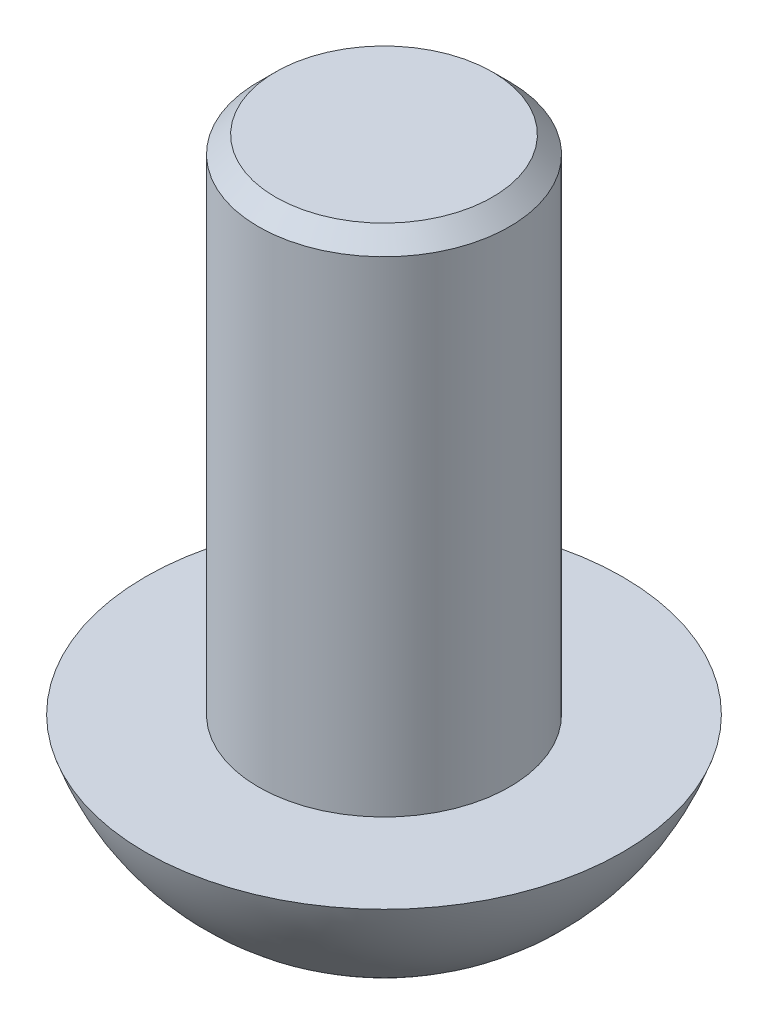
ISO-10303-21;
HEADER;
FILE_DESCRIPTION(('STEP AP214'),'2;1');
FILE_NAME('part.step','',(''),(''),'','','');
FILE_SCHEMA(('AUTOMOTIVE_DESIGN { 1 0 10303 214 1 1 1 1 }'));
ENDSEC;
DATA;
#1=APPLICATION_CONTEXT('core data for automotive mechanical design processes');
#2=APPLICATION_PROTOCOL_DEFINITION('international standard','automotive_design',2000,#1);
#3=PRODUCT_CONTEXT('',#1,'mechanical');
#4=PRODUCT('Part','Part','',(#3));
#5=PRODUCT_RELATED_PRODUCT_CATEGORY('part','',(#4));
#6=PRODUCT_DEFINITION_FORMATION('','',#4);
#7=PRODUCT_DEFINITION_CONTEXT('part definition',#1,'design');
#8=PRODUCT_DEFINITION('design','',#6,#7);
#9=PRODUCT_DEFINITION_SHAPE('','',#8);
#10=(LENGTH_UNIT() NAMED_UNIT(*) SI_UNIT(.MILLI.,.METRE.));
#11=(NAMED_UNIT(*) PLANE_ANGLE_UNIT() SI_UNIT($,.RADIAN.));
#12=(NAMED_UNIT(*) SI_UNIT($,.STERADIAN.) SOLID_ANGLE_UNIT());
#13=UNCERTAINTY_MEASURE_WITH_UNIT(LENGTH_MEASURE(1.E-05),#10,'distance_accuracy_value','');
#14=(GEOMETRIC_REPRESENTATION_CONTEXT(3) GLOBAL_UNCERTAINTY_ASSIGNED_CONTEXT((#13)) GLOBAL_UNIT_ASSIGNED_CONTEXT((#10,
#11,#12)) REPRESENTATION_CONTEXT('',''));
#15=CARTESIAN_POINT('',(0.,0.,0.));
#16=DIRECTION('',(0.,0.,1.));
#17=DIRECTION('',(1.,0.,0.));
#18=AXIS2_PLACEMENT_3D('',#15,#16,#17);
#19=CARTESIAN_POINT('',(0.,-2.75,0.));
#20=DIRECTION('',(0.,-1.,0.));
#21=DIRECTION('',(0.,0.,-1.));
#22=AXIS2_PLACEMENT_3D('',#19,#20,#21);
#23=PLANE('',#22);
#24=DIRECTION('',(0.5,0.,-0.866025403784438));
#25=VECTOR('',#24,1.);
#26=CARTESIAN_POINT('',(-1.29903810567666,-2.75,-0.750000000000001));
#27=LINE('',#26,#25);
#28=CARTESIAN_POINT('',(-1.73205080756888,-2.75,0.));
#29=VERTEX_POINT('',#28);
#30=CARTESIAN_POINT('',(-0.866025403784439,-2.75,-1.5));
#31=VERTEX_POINT('',#30);
#32=EDGE_CURVE('E11',#29,#31,#27,.T.);
#33=ORIENTED_EDGE('',*,*,#32,.F.);
#34=DIRECTION('',(-0.5,0.,-0.866025403784439));
#35=VECTOR('',#34,1.);
#36=CARTESIAN_POINT('',(-1.29903810567666,-2.75,0.75));
#37=LINE('',#36,#35);
#38=CARTESIAN_POINT('',(-0.866025403784439,-2.75,1.5));
#39=VERTEX_POINT('',#38);
#40=EDGE_CURVE('E48',#39,#29,#37,.T.);
#41=ORIENTED_EDGE('',*,*,#40,.F.);
#42=DIRECTION('',(-1.,0.,0.));
#43=VECTOR('',#42,1.);
#44=CARTESIAN_POINT('',(0.,-2.75,1.5));
#45=LINE('',#44,#43);
#46=CARTESIAN_POINT('',(0.866025403784438,-2.75,1.5));
#47=VERTEX_POINT('',#46);
#48=EDGE_CURVE('E104',#47,#39,#45,.T.);
#49=ORIENTED_EDGE('',*,*,#48,.F.);
#50=DIRECTION('',(-0.5,0.,0.866025403784438));
#51=VECTOR('',#50,1.);
#52=CARTESIAN_POINT('',(1.29903810567666,-2.75,0.750000000000001));
#53=LINE('',#52,#51);
#54=CARTESIAN_POINT('',(1.73205080756888,-2.75,0.));
#55=VERTEX_POINT('',#54);
#56=EDGE_CURVE('E98',#55,#47,#53,.T.);
#57=ORIENTED_EDGE('',*,*,#56,.F.);
#58=DIRECTION('',(0.5,0.,0.866025403784439));
#59=VECTOR('',#58,1.);
#60=CARTESIAN_POINT('',(1.29903810567666,-2.75,-0.749999999999999));
#61=LINE('',#60,#59);
#62=CARTESIAN_POINT('',(0.866025403784439,-2.75,-1.5));
#63=VERTEX_POINT('',#62);
#64=EDGE_CURVE('E101',#63,#55,#61,.T.);
#65=ORIENTED_EDGE('',*,*,#64,.F.);
#66=DIRECTION('',(1.,0.,0.));
#67=VECTOR('',#66,1.);
#68=CARTESIAN_POINT('',(0.,-2.75,-1.5));
#69=LINE('',#68,#67);
#70=EDGE_CURVE('E173',#31,#63,#69,.T.);
#71=ORIENTED_EDGE('',*,*,#70,.F.);
#72=EDGE_LOOP('',(#33,#41,#49,#57,#65,#71));
#73=FACE_BOUND('',#72,.T.);
#74=CARTESIAN_POINT('',(0.,-2.75,0.));
#75=DIRECTION('',(0.,-1.,0.));
#76=DIRECTION('',(0.,0.,-1.));
#77=AXIS2_PLACEMENT_3D('',#74,#75,#76);
#78=CIRCLE('',#77,2.5);
#79=CARTESIAN_POINT('',(2.5,-2.75,0.));
#80=VERTEX_POINT('',#79);
#81=EDGE_CURVE('E109',#80,#80,#78,.T.);
#82=ORIENTED_EDGE('',*,*,#81,.T.);
#83=EDGE_LOOP('',(#82));
#84=FACE_BOUND('',#83,.T.);
#85=ADVANCED_FACE('F39',(#73,#84),#23,.T.);
#86=CARTESIAN_POINT('',(0.,1.59090909090909,0.));
#87=DIRECTION('',(0.,-1.,0.));
#88=DIRECTION('',(1.,0.,0.));
#89=AXIS2_PLACEMENT_3D('',#86,#87,#88);
#90=SPHERICAL_SURFACE('',#89,5.00934044915468);
#91=CARTESIAN_POINT('',(0.,0.,0.));
#92=DIRECTION('',(0.,-1.,0.));
#93=DIRECTION('',(0.,0.,-1.));
#94=AXIS2_PLACEMENT_3D('',#91,#92,#93);
#95=CIRCLE('',#94,4.75);
#96=CARTESIAN_POINT('',(4.75,0.,0.));
#97=VERTEX_POINT('',#96);
#98=EDGE_CURVE('E179',#97,#97,#95,.T.);
#99=CARTESIAN_POINT('',(2.5,-2.75,0.));
#100=CARTESIAN_POINT('',(2.53278694875913,-2.73111755524917,0.));
#101=CARTESIAN_POINT('',(2.56535988781073,-2.71186351803924,0.));
#102=CARTESIAN_POINT('',(2.6300612032684,-2.67262244069928,0.));
#103=CARTESIAN_POINT('',(2.66218957967448,-2.65263540056923,0.));
#104=CARTESIAN_POINT('',(2.72598522661067,-2.61193849938707,0.));
#105=CARTESIAN_POINT('',(2.75765249714078,-2.59122863833496,0.));
#106=CARTESIAN_POINT('',(2.82050968698786,-2.54909674924687,0.));
#107=CARTESIAN_POINT('',(2.85169960630483,-2.5276747212109,0.));
#108=CARTESIAN_POINT('',(2.91358607707779,-2.48412949070693,0.));
#109=CARTESIAN_POINT('',(2.94428262853378,-2.46200628823893,0.));
#110=CARTESIAN_POINT('',(3.00516660462735,-2.4170700686518,0.));
#111=CARTESIAN_POINT('',(3.03535402926492,-2.39425705153268,0.));
#112=CARTESIAN_POINT('',(3.09520425297794,-2.34795291464132,0.));
#113=CARTESIAN_POINT('',(3.12486705205339,-2.32446179486909,0.));
#114=CARTESIAN_POINT('',(3.1836527955612,-2.27681351333336,0.));
#115=CARTESIAN_POINT('',(3.21277573999356,-2.25265635156986,0.));
#116=CARTESIAN_POINT('',(3.27046682221599,-2.20368838852606,0.));
#117=CARTESIAN_POINT('',(3.29903496000604,-2.17887758724577,0.));
#118=CARTESIAN_POINT('',(3.35560176180999,-2.1286150832646,0.));
#119=CARTESIAN_POINT('',(3.38360042582388,-2.10316338056373,0.));
#120=CARTESIAN_POINT('',(3.43901390530852,-2.05163214087216,0.));
#121=CARTESIAN_POINT('',(3.46642872077926,-2.02555260388147,0.));
#122=CARTESIAN_POINT('',(3.52066042816535,-1.97277908507946,0.));
#123=CARTESIAN_POINT('',(3.54747732008068,-1.94608510326814,0.));
#124=CARTESIAN_POINT('',(3.60049941232258,-1.89209639975487,0.));
#125=CARTESIAN_POINT('',(3.62670461264913,-1.86480167805291,0.));
#126=CARTESIAN_POINT('',(3.67848986772817,-1.80962550811377,0.));
#127=CARTESIAN_POINT('',(3.70406992248065,-1.78174405987659,0.));
#128=CARTESIAN_POINT('',(3.75459175338155,-1.72540875145307,0.));
#129=CARTESIAN_POINT('',(3.77953352952998,-1.69695489126673,0.));
#130=CARTESIAN_POINT('',(3.82876599789079,-1.63948936741238,0.));
#131=CARTESIAN_POINT('',(3.85305669010317,-1.61047770374437,0.));
#132=CARTESIAN_POINT('',(3.90097451953224,-1.55191146777551,0.));
#133=CARTESIAN_POINT('',(3.92460165674892,-1.52235689547466,0.));
#134=CARTESIAN_POINT('',(3.97118024580204,-1.4627200158231,0.));
#135=CARTESIAN_POINT('',(3.99413169763847,-1.4326377084724,0.));
#136=CARTESIAN_POINT('',(4.03934713244946,-1.37196080324804,0.));
#137=CARTESIAN_POINT('',(4.06161111542403,-1.34136620537439,0.));
#138=CARTESIAN_POINT('',(4.10544018198238,-1.2796804266456,0.));
#139=CARTESIAN_POINT('',(4.12700526556617,-1.24858924579047,0.));
#140=CARTESIAN_POINT('',(4.16942546163525,-1.18592626359034,0.));
#141=CARTESIAN_POINT('',(4.19028057412053,-1.15435446224534,0.));
#142=CARTESIAN_POINT('',(4.2312701207906,-1.09074644831205,0.));
#143=CARTESIAN_POINT('',(4.25140455497539,-1.05871023572376,0.));
#144=CARTESIAN_POINT('',(4.29094240784443,-0.994189846983065,0.));
#145=CARTESIAN_POINT('',(4.31034582652867,-0.961705670830664,0.));
#146=CARTESIAN_POINT('',(4.34841168650943,-0.896306032630523,0.));
#147=CARTESIAN_POINT('',(4.36707412780594,-0.863390570582783,0.));
#148=CARTESIAN_POINT('',(4.4036484515375,-0.797145259682826,0.));
#149=CARTESIAN_POINT('',(4.42156033397254,-0.763815410830609,0.));
#150=CARTESIAN_POINT('',(4.45662434389216,-0.696758438177261,0.));
#151=CARTESIAN_POINT('',(4.47377647137673,-0.663031314376131,0.));
#152=CARTESIAN_POINT('',(4.50731216521815,-0.595197107589832,0.));
#153=CARTESIAN_POINT('',(4.52369573157501,-0.561090024604663,0.));
#154=CARTESIAN_POINT('',(4.55568589214188,-0.492513410495701,0.));
#155=CARTESIAN_POINT('',(4.5712924863519,-0.458043879371907,0.));
#156=CARTESIAN_POINT('',(4.601720688376,-0.388760065346138,0.));
#157=CARTESIAN_POINT('',(4.61654229619008,-0.353945782444162,0.));
#158=CARTESIAN_POINT('',(4.64539292215818,-0.283990341091463,0.));
#159=CARTESIAN_POINT('',(4.65942194031221,-0.248849182640739,0.));
#160=CARTESIAN_POINT('',(4.68668016088954,-0.178258023528602,0.));
#161=CARTESIAN_POINT('',(4.69990936331284,-0.142808022867188,0.));
#162=CARTESIAN_POINT('',(4.72556124794158,-0.0716174112126421,0.));
#163=CARTESIAN_POINT('',(4.73798393014703,-0.0358768002195088,0.));
#164=CARTESIAN_POINT('',(4.75,0.,0.));
#165=B_SPLINE_CURVE_WITH_KNOTS('',3,(#99,#100,#101,#102,#103,#104,#105,#106,#107,#108,#109,#110,
#111,#112,#113,#114,#115,#116,#117,#118,#119,#120,#121,#122,#123,#124,#125,#126,#127,#128,#129,
#130,#131,#132,#133,#134,#135,#136,#137,#138,#139,#140,#141,#142,#143,#144,#145,#146,#147,#148,
#149,#150,#151,#152,#153,#154,#155,#156,#157,#158,#159,#160,#161,#162,#163,#164),.UNSPECIFIED.,
.F.,.F.,(4,2,2,2,2,2,2,2,2,2,2,2,2,2,2,2,2,2,2,2,2,2,2,2,2,2,2,2,2,2,2,2,4),(0.,
0.11350429129235,0.227008582584699,0.340512873877048,0.454017165169397,0.567521456461747,
0.681025747754095,0.794530039046445,0.908034330338795,1.02153862163114,1.13504291292349,
1.24854720421584,1.36205149550819,1.47555578680054,1.58906007809289,1.70256436938524,
1.81606866067759,1.92957295196994,2.04307724326229,2.15658153455464,2.27008582584699,
2.38359011713934,2.49709440843168,2.61059869972403,2.72410299101638,2.83760728230873,
2.95111157360108,3.06461586489343,3.17812015618578,3.29162444747813,3.40512873877048,
3.51863303006283,3.63213732135518),.UNSPECIFIED.);
#166=EDGE_CURVE('BSEAM200',#80,#97,#165,.T.);
#167=ORIENTED_EDGE('',*,*,#81,.F.);
#168=ORIENTED_EDGE('',*,*,#98,.T.);
#169=ORIENTED_EDGE('',*,*,#166,.T.);
#170=ORIENTED_EDGE('',*,*,#166,.F.);
#171=EDGE_LOOP('',(#167,#169,#168,#170));
#172=FACE_BOUND('',#171,.T.);
#173=ADVANCED_FACE('F200',(#172),#90,.T.);
#174=CARTESIAN_POINT('',(0.,0.,0.));
#175=DIRECTION('',(0.,-1.,0.));
#176=DIRECTION('',(0.,0.,-1.));
#177=AXIS2_PLACEMENT_3D('',#174,#175,#176);
#178=PLANE('',#177);
#179=ORIENTED_EDGE('',*,*,#98,.F.);
#180=EDGE_LOOP('',(#179));
#181=FACE_BOUND('',#180,.T.);
#182=CARTESIAN_POINT('',(0.,0.,0.));
#183=DIRECTION('',(0.,-1.,0.));
#184=DIRECTION('',(0.,0.,-1.));
#185=AXIS2_PLACEMENT_3D('',#182,#183,#184);
#186=CIRCLE('',#185,2.5);
#187=CARTESIAN_POINT('',(0.,0.,-2.5));
#188=VERTEX_POINT('',#187);
#189=EDGE_CURVE('E182',#188,#188,#186,.T.);
#190=ORIENTED_EDGE('',*,*,#189,.T.);
#191=EDGE_LOOP('',(#190));
#192=FACE_BOUND('',#191,.T.);
#193=ADVANCED_FACE('F204',(#181,#192),#178,.F.);
#194=CARTESIAN_POINT('',(0.,0.,0.));
#195=DIRECTION('',(0.,-1.,0.));
#196=DIRECTION('',(0.,0.,-1.));
#197=AXIS2_PLACEMENT_3D('',#194,#195,#196);
#198=CYLINDRICAL_SURFACE('',#197,2.5);
#199=CARTESIAN_POINT('',(0.,9.66000000000003,0.));
#200=DIRECTION('',(0.,-1.,0.));
#201=DIRECTION('',(0.,0.,-1.));
#202=AXIS2_PLACEMENT_3D('',#199,#200,#201);
#203=CIRCLE('',#202,2.5);
#204=CARTESIAN_POINT('',(0.,9.66000000000003,-2.5));
#205=VERTEX_POINT('',#204);
#206=EDGE_CURVE('E184',#205,#205,#203,.T.);
#207=ORIENTED_EDGE('',*,*,#206,.T.);
#208=EDGE_LOOP('',(#207));
#209=FACE_BOUND('',#208,.T.);
#210=ORIENTED_EDGE('',*,*,#189,.F.);
#211=EDGE_LOOP('',(#210));
#212=FACE_BOUND('',#211,.T.);
#213=ADVANCED_FACE('F198',(#209,#212),#198,.T.);
#214=CARTESIAN_POINT('',(0.,9.99999999999999,0.));
#215=DIRECTION('',(0.,-1.,0.));
#216=DIRECTION('',(0.,0.,-1.));
#217=AXIS2_PLACEMENT_3D('',#214,#215,#216);
#218=CONICAL_SURFACE('',#217,2.16,0.785398163397499);
#219=ORIENTED_EDGE('',*,*,#206,.F.);
#220=EDGE_LOOP('',(#219));
#221=FACE_BOUND('',#220,.T.);
#222=CARTESIAN_POINT('',(0.,9.99999999999999,0.));
#223=DIRECTION('',(0.,-1.,0.));
#224=DIRECTION('',(0.,0.,-1.));
#225=AXIS2_PLACEMENT_3D('',#222,#223,#224);
#226=CIRCLE('',#225,2.16);
#227=CARTESIAN_POINT('',(0.,9.99999999999999,-2.16));
#228=VERTEX_POINT('',#227);
#229=EDGE_CURVE('E130',#228,#228,#226,.T.);
#230=ORIENTED_EDGE('',*,*,#229,.T.);
#231=EDGE_LOOP('',(#230));
#232=FACE_BOUND('',#231,.T.);
#233=ADVANCED_FACE('F191',(#221,#232),#218,.T.);
#234=CARTESIAN_POINT('',(0.,9.99999999999999,0.));
#235=DIRECTION('',(0.,1.,0.));
#236=DIRECTION('',(0.,0.,1.));
#237=AXIS2_PLACEMENT_3D('',#234,#235,#236);
#238=PLANE('',#237);
#239=ORIENTED_EDGE('',*,*,#229,.F.);
#240=EDGE_LOOP('',(#239));
#241=FACE_BOUND('',#240,.T.);
#242=ADVANCED_FACE('F143',(#241),#238,.T.);
#243=CARTESIAN_POINT('',(0.866025403784439,10.001,-1.5));
#244=DIRECTION('',(0.866025403784439,0.,-0.5));
#245=DIRECTION('',(-0.5,0.,-0.866025403784439));
#246=AXIS2_PLACEMENT_3D('',#243,#244,#245);
#247=PLANE('',#246);
#248=CARTESIAN_POINT('',(1.73216627762272,-0.866083144584475,0.000200000000001134));
#249=CARTESIAN_POINT('',(1.70775229140137,-0.853877083687556,-0.0420862645506495));
#250=CARTESIAN_POINT('',(1.68324773163161,-0.842393820565593,-0.0845294070889867));
#251=CARTESIAN_POINT('',(1.63404339711189,-0.82111755451679,-0.169753814429754));
#252=CARTESIAN_POINT('',(1.60934352861306,-0.81132542224019,-0.212535241609996));
#253=CARTESIAN_POINT('',(1.53491027252247,-0.784850593400429,-0.341457422931694));
#254=CARTESIAN_POINT('',(1.48489969951102,-0.771098864197713,-0.428078276303156));
#255=CARTESIAN_POINT('',(1.38558182822343,-0.753434846911863,-0.600101875472841));
#256=CARTESIAN_POINT('',(1.33628447941939,-0.749305446328198,-0.685487388279889));
#257=CARTESIAN_POINT('',(1.23777722101029,-0.750886772120878,-0.856106964758773));
#258=CARTESIAN_POINT('',(1.18856727464192,-0.756586789858081,-0.941341092106532));
#259=CARTESIAN_POINT('',(1.11666042288991,-0.771525443484202,-1.06588741275333));
#260=CARTESIAN_POINT('',(1.0937643677373,-0.777276404574937,-1.10554454357055));
#261=CARTESIAN_POINT('',(1.0480984962381,-0.790566259252513,-1.18464015317907));
#262=CARTESIAN_POINT('',(1.02532869368376,-0.798105344389664,-1.2240786080815));
#263=CARTESIAN_POINT('',(0.979685257913279,-0.814880325338798,-1.30313535786798));
#264=CARTESIAN_POINT('',(0.95681330107013,-0.824134215741857,-1.34275074918884));
#265=CARTESIAN_POINT('',(0.911237314267279,-0.844079610475272,-1.42169067393647));
#266=CARTESIAN_POINT('',(0.888533210867198,-0.854770441356161,-1.4610153345657));
#267=CARTESIAN_POINT('',(0.865909933730601,-0.866083144584471,-1.5002));
#268=B_SPLINE_CURVE_WITH_KNOTS('',3,(#248,#249,#250,#251,#252,#253,#254,#255,#256,#257,#258,
#259,#260,#261,#262,#263,#264,#265,#266,#267),.UNSPECIFIED.,.F.,.F.,(4,2,2,2,2,2,2,2,2,4),(0.,
0.150982301308662,0.302042103083996,0.604510947327789,0.900086064766037,1.19533937191465,
1.33376744084208,1.47221034538745,1.61219801406029,1.75212030214296),.UNSPECIFIED.);
#269=CARTESIAN_POINT('',(1.73205080756888,-0.866025403784438,0.));
#270=VERTEX_POINT('',#269);
#271=CARTESIAN_POINT('',(0.866025403784439,-0.866025403784439,-1.5));
#272=VERTEX_POINT('',#271);
#273=EDGE_CURVE('E71',#270,#272,#268,.T.);
#274=ORIENTED_EDGE('',*,*,#273,.T.);
#275=DIRECTION('',(0.,-1.,0.));
#276=VECTOR('',#275,1.);
#277=CARTESIAN_POINT('',(0.866025403784439,10.001,-1.5));
#278=LINE('',#277,#276);
#279=EDGE_CURVE('E114',#272,#63,#278,.T.);
#280=ORIENTED_EDGE('',*,*,#279,.T.);
#281=ORIENTED_EDGE('',*,*,#64,.T.);
#282=DIRECTION('',(0.,-1.,0.));
#283=VECTOR('',#282,1.);
#284=CARTESIAN_POINT('',(1.73205080756888,10.001,0.));
#285=LINE('',#284,#283);
#286=EDGE_CURVE('E112',#270,#55,#285,.T.);
#287=ORIENTED_EDGE('',*,*,#286,.F.);
#288=EDGE_LOOP('',(#274,#280,#281,#287));
#289=FACE_BOUND('',#288,.T.);
#290=ADVANCED_FACE('F111',(#289),#247,.F.);
#291=CARTESIAN_POINT('',(-0.866025403784439,10.001,-1.5));
#292=DIRECTION('',(0.,0.,-1.));
#293=DIRECTION('',(-1.,0.,0.));
#294=AXIS2_PLACEMENT_3D('',#291,#292,#293);
#295=PLANE('',#294);
#296=CARTESIAN_POINT('',(-2.35231656947287,-1.39493666908364,-1.5));
#297=CARTESIAN_POINT('',(-2.28477380377093,-1.36646935269176,-1.5));
#298=CARTESIAN_POINT('',(-2.21710775911768,-1.33829009262519,-1.5));
#299=CARTESIAN_POINT('',(-2.08146326397134,-1.28266931350327,-1.5));
#300=CARTESIAN_POINT('',(-2.01348477422759,-1.2552278902783,-1.5));
#301=CARTESIAN_POINT('',(-1.87691212587726,-1.20115094958764,-1.5));
#302=CARTESIAN_POINT('',(-1.80831661563164,-1.1745188290445,-1.5));
#303=CARTESIAN_POINT('',(-1.67069200521028,-1.12240851976775,-1.5));
#304=CARTESIAN_POINT('',(-1.60166292113293,-1.09693028847585,-1.5));
#305=CARTESIAN_POINT('',(-1.39449939690292,-1.02289237283433,-1.5));
#306=CARTESIAN_POINT('',(-1.25559445591549,-0.976448565130542,-1.5));
#307=CARTESIAN_POINT('',(-0.975104565627606,-0.892777078851334,-1.5));
#308=CARTESIAN_POINT('',(-0.833523521465561,-0.855536942111052,-1.5));
#309=CARTESIAN_POINT('',(-0.59962425710928,-0.806659754328136,-1.5));
#310=CARTESIAN_POINT('',(-0.508242321428324,-0.790640539514287,-1.5));
#311=CARTESIAN_POINT('',(-0.324478481030171,-0.766072658035322,-1.5));
#312=CARTESIAN_POINT('',(-0.232096993796861,-0.757520985736664,-1.5));
#313=CARTESIAN_POINT('',(-0.0469007090860964,-0.74895169286509,-1.5));
#314=CARTESIAN_POINT('',(0.0459141780521713,-0.748935924207199,-1.5));
#315=CARTESIAN_POINT('',(0.231122287651961,-0.757446265307669,-1.5));
#316=CARTESIAN_POINT('',(0.323515539711624,-0.765971765919515,-1.5));
#317=CARTESIAN_POINT('',(0.609003915420121,-0.804053271730787,-1.5));
#318=CARTESIAN_POINT('',(0.800357511936414,-0.846442381360249,-1.5));
#319=CARTESIAN_POINT('',(1.08343842044328,-0.924333968870199,-1.5));
#320=CARTESIAN_POINT('',(1.17739668861203,-0.952781900897031,-1.5));
#321=CARTESIAN_POINT('',(1.36419587468543,-1.0131588886465,-1.5));
#322=CARTESIAN_POINT('',(1.45703703836984,-1.04508716249494,-1.5));
#323=CARTESIAN_POINT('',(1.64359852645011,-1.11210657667938,-1.5));
#324=CARTESIAN_POINT('',(1.73730065048455,-1.14724728094161,-1.5));
#325=CARTESIAN_POINT('',(1.92397169962204,-1.2194442506156,-1.5));
#326=CARTESIAN_POINT('',(2.01694056479423,-1.25650067077088,-1.5));
#327=CARTESIAN_POINT('',(2.20122371412327,-1.3315927275328,-1.5));
#328=CARTESIAN_POINT('',(2.29254468935279,-1.36961204763237,-1.5));
#329=CARTESIAN_POINT('',(2.47471133267779,-1.44671223874088,-1.5));
#330=CARTESIAN_POINT('',(2.5655571133765,-1.48579284328326,-1.5));
#331=CARTESIAN_POINT('',(2.65623410958252,-1.525252409022,-1.5));
#332=B_SPLINE_CURVE_WITH_KNOTS('',3,(#296,#297,#298,#299,#300,#301,#302,#303,#304,#305,#306,
#307,#308,#309,#310,#311,#312,#313,#314,#315,#316,#317,#318,#319,#320,#321,#322,#323,#324,#325,
#326,#327,#328,#329,#330,#331),.UNSPECIFIED.,.F.,.F.,(4,2,2,2,2,2,2,2,2,2,2,2,2,2,2,2,2,4),(0.,
0.219892033169458,0.439812489335133,0.660555229498119,0.881289821477904,1.32051374792657,
1.75913984026258,2.03722194461592,2.31519207121243,2.59322250505573,2.87123311172702,
3.45698882637886,3.75151246499728,4.045970073413,4.34617402175953,4.64640225732783,
4.94315253503939,5.23982898148908),.UNSPECIFIED.);
#333=CARTESIAN_POINT('',(-0.866025403784439,-0.866025403784439,-1.5));
#334=VERTEX_POINT('',#333);
#335=EDGE_CURVE('E152',#272,#334,#332,.F.);
#336=ORIENTED_EDGE('',*,*,#335,.T.);
#337=DIRECTION('',(0.,-1.,0.));
#338=VECTOR('',#337,1.);
#339=CARTESIAN_POINT('',(-0.866025403784439,10.001,-1.5));
#340=LINE('',#339,#338);
#341=EDGE_CURVE('E160',#334,#31,#340,.T.);
#342=ORIENTED_EDGE('',*,*,#341,.T.);
#343=ORIENTED_EDGE('',*,*,#70,.T.);
#344=ORIENTED_EDGE('',*,*,#279,.F.);
#345=EDGE_LOOP('',(#336,#342,#343,#344));
#346=FACE_BOUND('',#345,.T.);
#347=ADVANCED_FACE('F142',(#346),#295,.F.);
#348=CARTESIAN_POINT('',(-1.73205080756888,10.001,0.));
#349=DIRECTION('',(-0.866025403784438,0.,-0.5));
#350=DIRECTION('',(-0.5,0.,0.866025403784438));
#351=AXIS2_PLACEMENT_3D('',#348,#349,#350);
#352=PLANE('',#351);
#353=CARTESIAN_POINT('',(-0.865909933730601,-0.866083144584475,-1.5002));
#354=CARTESIAN_POINT('',(-0.890323919951943,-0.853877083687556,-1.45791373544935));
#355=CARTESIAN_POINT('',(-0.914828479721706,-0.842393820565593,-1.41547059291101));
#356=CARTESIAN_POINT('',(-0.964032814241424,-0.82111755451679,-1.33024618557025));
#357=CARTESIAN_POINT('',(-0.988732682740253,-0.81132542224019,-1.28746475839));
#358=CARTESIAN_POINT('',(-1.06316593883085,-0.784850593400429,-1.15854257706831));
#359=CARTESIAN_POINT('',(-1.1131765118423,-0.771098864197713,-1.07192172369684));
#360=CARTESIAN_POINT('',(-1.21249438312988,-0.753434846911864,-0.899898124527159));
#361=CARTESIAN_POINT('',(-1.26179173193393,-0.749305446328198,-0.814512611720111));
#362=CARTESIAN_POINT('',(-1.36029899034303,-0.750886772120878,-0.643893035241227));
#363=CARTESIAN_POINT('',(-1.4095089367114,-0.756586789858081,-0.558658907893468));
#364=CARTESIAN_POINT('',(-1.48141578846341,-0.771525443484202,-0.434112587246667));
#365=CARTESIAN_POINT('',(-1.50431184361602,-0.777276404574938,-0.394455456429455));
#366=CARTESIAN_POINT('',(-1.54997771511521,-0.790566259252513,-0.315359846820933));
#367=CARTESIAN_POINT('',(-1.57274751766956,-0.798105344389665,-0.275921391918501));
#368=CARTESIAN_POINT('',(-1.61839095344004,-0.814880325338799,-0.196864642132019));
#369=CARTESIAN_POINT('',(-1.64126291028319,-0.824134215741857,-0.157249250811162));
#370=CARTESIAN_POINT('',(-1.68683889708604,-0.844079610475272,-0.0783093260635356));
#371=CARTESIAN_POINT('',(-1.70954300048612,-0.854770441356161,-0.0389846654342987));
#372=CARTESIAN_POINT('',(-1.73216627762272,-0.866083144584471,0.00019999999999917));
#373=B_SPLINE_CURVE_WITH_KNOTS('',3,(#353,#354,#355,#356,#357,#358,#359,#360,#361,#362,#363,
#364,#365,#366,#367,#368,#369,#370,#371,#372),.UNSPECIFIED.,.F.,.F.,(4,2,2,2,2,2,2,2,2,4),(0.,
0.150982301308662,0.302042103083997,0.604510947327789,0.900086064766037,1.19533937191465,
1.33376744084208,1.47221034538745,1.61219801406029,1.75212030214296),.UNSPECIFIED.);
#374=CARTESIAN_POINT('',(-1.73205080756888,-0.866025403784439,0.));
#375=VERTEX_POINT('',#374);
#376=EDGE_CURVE('E276',#334,#375,#373,.T.);
#377=ORIENTED_EDGE('',*,*,#376,.T.);
#378=DIRECTION('',(0.,-1.,0.));
#379=VECTOR('',#378,1.);
#380=CARTESIAN_POINT('',(-1.73205080756888,10.001,0.));
#381=LINE('',#380,#379);
#382=EDGE_CURVE('E163',#375,#29,#381,.T.);
#383=ORIENTED_EDGE('',*,*,#382,.T.);
#384=ORIENTED_EDGE('',*,*,#32,.T.);
#385=ORIENTED_EDGE('',*,*,#341,.F.);
#386=EDGE_LOOP('',(#377,#383,#384,#385));
#387=FACE_BOUND('',#386,.T.);
#388=ADVANCED_FACE('F236',(#387),#352,.F.);
#389=CARTESIAN_POINT('',(-0.866025403784439,10.001,1.5));
#390=DIRECTION('',(-0.866025403784439,0.,0.5));
#391=DIRECTION('',(0.5,0.,0.866025403784439));
#392=AXIS2_PLACEMENT_3D('',#389,#390,#391);
#393=PLANE('',#392);
#394=CARTESIAN_POINT('',(-1.73216627762272,-0.866083144584475,-0.000200000000001222));
#395=CARTESIAN_POINT('',(-1.70775229140137,-0.853877083687556,0.0420862645506496));
#396=CARTESIAN_POINT('',(-1.68324773163161,-0.842393820565593,0.0845294070889868));
#397=CARTESIAN_POINT('',(-1.63404339711189,-0.82111755451679,0.169753814429754));
#398=CARTESIAN_POINT('',(-1.60934352861306,-0.81132542224019,0.212535241609997));
#399=CARTESIAN_POINT('',(-1.53491027252247,-0.784850593400429,0.341457422931694));
#400=CARTESIAN_POINT('',(-1.48489969951102,-0.771098864197713,0.428078276303157));
#401=CARTESIAN_POINT('',(-1.38558182822343,-0.753434846911863,0.600101875472841));
#402=CARTESIAN_POINT('',(-1.33628447941939,-0.749305446328198,0.685487388279889));
#403=CARTESIAN_POINT('',(-1.23777722101029,-0.750886772120878,0.856106964758773));
#404=CARTESIAN_POINT('',(-1.18856727464192,-0.756586789858081,0.941341092106532));
#405=CARTESIAN_POINT('',(-1.11666042288991,-0.771525443484202,1.06588741275333));
#406=CARTESIAN_POINT('',(-1.0937643677373,-0.777276404574938,1.10554454357055));
#407=CARTESIAN_POINT('',(-1.0480984962381,-0.790566259252513,1.18464015317907));
#408=CARTESIAN_POINT('',(-1.02532869368376,-0.798105344389664,1.2240786080815));
#409=CARTESIAN_POINT('',(-0.97968525791328,-0.814880325338799,1.30313535786798));
#410=CARTESIAN_POINT('',(-0.95681330107013,-0.824134215741857,1.34275074918884));
#411=CARTESIAN_POINT('',(-0.911237314267279,-0.844079610475272,1.42169067393647));
#412=CARTESIAN_POINT('',(-0.888533210867199,-0.854770441356161,1.4610153345657));
#413=CARTESIAN_POINT('',(-0.865909933730601,-0.866083144584471,1.5002));
#414=B_SPLINE_CURVE_WITH_KNOTS('',3,(#394,#395,#396,#397,#398,#399,#400,#401,#402,#403,#404,
#405,#406,#407,#408,#409,#410,#411,#412,#413),.UNSPECIFIED.,.F.,.F.,(4,2,2,2,2,2,2,2,2,4),(0.,
0.150982301308662,0.302042103083997,0.604510947327789,0.900086064766037,1.19533937191465,
1.33376744084208,1.47221034538745,1.61219801406029,1.75212030214296),.UNSPECIFIED.);
#415=CARTESIAN_POINT('',(-0.866025403784466,-0.866025403784417,1.5));
#416=VERTEX_POINT('',#415);
#417=EDGE_CURVE('E171',#375,#416,#414,.T.);
#418=ORIENTED_EDGE('',*,*,#417,.T.);
#419=DIRECTION('',(0.,-1.,0.));
#420=VECTOR('',#419,1.);
#421=CARTESIAN_POINT('',(-0.866025403784439,10.001,1.5));
#422=LINE('',#421,#420);
#423=EDGE_CURVE('E120',#416,#39,#422,.T.);
#424=ORIENTED_EDGE('',*,*,#423,.T.);
#425=ORIENTED_EDGE('',*,*,#40,.T.);
#426=ORIENTED_EDGE('',*,*,#382,.F.);
#427=EDGE_LOOP('',(#418,#424,#425,#426));
#428=FACE_BOUND('',#427,.T.);
#429=ADVANCED_FACE('F169',(#428),#393,.F.);
#430=CARTESIAN_POINT('',(0.866025403784438,10.001,1.5));
#431=DIRECTION('',(0.,0.,1.));
#432=DIRECTION('',(1.,0.,0.));
#433=AXIS2_PLACEMENT_3D('',#430,#431,#432);
#434=PLANE('',#433);
#435=CARTESIAN_POINT('',(-2.3523165684896,-1.39493666866911,1.5));
#436=CARTESIAN_POINT('',(-2.28477380282255,-1.36646935229537,1.5));
#437=CARTESIAN_POINT('',(-2.2171077582042,-1.33829009224693,1.5));
#438=CARTESIAN_POINT('',(-2.08146326312778,-1.28266931316112,1.5));
#439=CARTESIAN_POINT('',(-2.01348477341903,-1.25522788995414,1.5));
#440=CARTESIAN_POINT('',(-1.87691212513925,-1.20115094929944,1.5));
#441=CARTESIAN_POINT('',(-1.80831661492917,-1.17451882877424,1.5));
#442=CARTESIAN_POINT('',(-1.67069200457912,-1.12240851953302,1.5));
#443=CARTESIAN_POINT('',(-1.60166292053754,-1.09693028825867,1.5));
#444=CARTESIAN_POINT('',(-1.39449939641833,-1.02289237267001,1.5));
#445=CARTESIAN_POINT('',(-1.25559445550645,-0.976448565000482,1.5));
#446=CARTESIAN_POINT('',(-0.975104565371995,-0.8927770787831,1.5));
#447=CARTESIAN_POINT('',(-0.833523521287815,-0.85553694207041,1.5));
#448=CARTESIAN_POINT('',(-0.599624256994324,-0.806659754306319,1.5));
#449=CARTESIAN_POINT('',(-0.508242321296307,-0.790640539492536,1.5));
#450=CARTESIAN_POINT('',(-0.324478480863953,-0.766072658017189,1.5));
#451=CARTESIAN_POINT('',(-0.232096993613505,-0.757520985722076,1.5));
#452=CARTESIAN_POINT('',(-0.0469007088676442,-0.748951692861074,1.5));
#453=CARTESIAN_POINT('',(0.0459141782885864,-0.748935924210324,1.5));
#454=CARTESIAN_POINT('',(0.231122287923506,-0.757446265327898,1.5));
#455=CARTESIAN_POINT('',(0.323515540000335,-0.765971765949714,1.5));
#456=CARTESIAN_POINT('',(0.609003915828525,-0.804053271802829,1.5));
#457=CARTESIAN_POINT('',(0.800357512444201,-0.846442381477788,1.5));
#458=CARTESIAN_POINT('',(1.08343842109683,-0.924333969061198,1.5));
#459=CARTESIAN_POINT('',(1.17739668931386,-0.952781901113503,1.5));
#460=CARTESIAN_POINT('',(1.36419587548317,-1.01315888891469,1.5));
#461=CARTESIAN_POINT('',(1.45703703921522,-1.04508716278937,1.5));
#462=CARTESIAN_POINT('',(1.6435985273879,-1.11210657702571,1.5));
#463=CARTESIAN_POINT('',(1.73730065146715,-1.14724728131349,1.5));
#464=CARTESIAN_POINT('',(1.92397170069416,-1.21944425103838,1.5));
#465=CARTESIAN_POINT('',(2.01694056591108,-1.256500671219,1.5));
#466=CARTESIAN_POINT('',(2.20122371532876,-1.33159272803093,1.5));
#467=CARTESIAN_POINT('',(2.29254469060217,-1.36961204815515,1.5));
#468=CARTESIAN_POINT('',(2.47471133401502,-1.4467122393127,1.5));
#469=CARTESIAN_POINT('',(2.56555711475767,-1.48579284387947,1.5));
#470=CARTESIAN_POINT('',(2.65623411100767,-1.52525240964247,1.5));
#471=B_SPLINE_CURVE_WITH_KNOTS('',3,(#435,#436,#437,#438,#439,#440,#441,#442,#443,#444,#445,
#446,#447,#448,#449,#450,#451,#452,#453,#454,#455,#456,#457,#458,#459,#460,#461,#462,#463,#464,
#465,#466,#467,#468,#469,#470),.UNSPECIFIED.,.F.,.F.,(4,2,2,2,2,2,2,2,2,2,2,2,2,2,2,2,2,4),(0.,
0.219892033051887,0.43981248909997,0.660555229144056,0.881289821004951,1.32051374720611,
1.75913983929594,2.03722194369948,2.31519207034595,2.59322250424289,2.87123311096808,
3.45698882593853,3.75151246471783,4.04597007329428,4.3461740217936,4.64640225751472,
4.9431525353763,5.23982898197601),.UNSPECIFIED.);
#472=CARTESIAN_POINT('',(0.866025403784438,-0.866025403784438,1.5));
#473=VERTEX_POINT('',#472);
#474=EDGE_CURVE('E59',#416,#473,#471,.T.);
#475=ORIENTED_EDGE('',*,*,#474,.T.);
#476=DIRECTION('',(0.,-1.,0.));
#477=VECTOR('',#476,1.);
#478=CARTESIAN_POINT('',(0.866025403784438,10.001,1.5));
#479=LINE('',#478,#477);
#480=EDGE_CURVE('E118',#473,#47,#479,.T.);
#481=ORIENTED_EDGE('',*,*,#480,.T.);
#482=ORIENTED_EDGE('',*,*,#48,.T.);
#483=ORIENTED_EDGE('',*,*,#423,.F.);
#484=EDGE_LOOP('',(#475,#481,#482,#483));
#485=FACE_BOUND('',#484,.T.);
#486=ADVANCED_FACE('F136',(#485),#434,.F.);
#487=CARTESIAN_POINT('',(1.73205080756888,10.001,0.));
#488=DIRECTION('',(0.866025403784438,0.,0.5));
#489=DIRECTION('',(0.5,0.,-0.866025403784438));
#490=AXIS2_PLACEMENT_3D('',#487,#488,#489);
#491=PLANE('',#490);
#492=CARTESIAN_POINT('',(0.8659099337306,-0.866083144584475,1.5002));
#493=CARTESIAN_POINT('',(0.890323919951942,-0.853877083687555,1.45791373544935));
#494=CARTESIAN_POINT('',(0.914828479721705,-0.842393820565592,1.41547059291101));
#495=CARTESIAN_POINT('',(0.964032814241423,-0.82111755451679,1.33024618557025));
#496=CARTESIAN_POINT('',(0.988732682740252,-0.81132542224019,1.28746475839));
#497=CARTESIAN_POINT('',(1.06316593883085,-0.784850593400429,1.15854257706831));
#498=CARTESIAN_POINT('',(1.1131765118423,-0.771098864197713,1.07192172369684));
#499=CARTESIAN_POINT('',(1.21249438312988,-0.753434846911863,0.899898124527159));
#500=CARTESIAN_POINT('',(1.26179173193393,-0.749305446328198,0.81451261172011));
#501=CARTESIAN_POINT('',(1.36029899034303,-0.750886772120878,0.643893035241227));
#502=CARTESIAN_POINT('',(1.4095089367114,-0.756586789858081,0.558658907893468));
#503=CARTESIAN_POINT('',(1.48141578846341,-0.771525443484202,0.434112587246667));
#504=CARTESIAN_POINT('',(1.50431184361602,-0.777276404574937,0.394455456429455));
#505=CARTESIAN_POINT('',(1.54997771511521,-0.790566259252513,0.315359846820932));
#506=CARTESIAN_POINT('',(1.57274751766956,-0.798105344389664,0.2759213919185));
#507=CARTESIAN_POINT('',(1.61839095344004,-0.814880325338799,0.196864642132019));
#508=CARTESIAN_POINT('',(1.64126291028319,-0.824134215741857,0.157249250811161));
#509=CARTESIAN_POINT('',(1.68683889708604,-0.844079610475272,0.0783093260635353));
#510=CARTESIAN_POINT('',(1.70954300048612,-0.854770441356161,0.0389846654342985));
#511=CARTESIAN_POINT('',(1.73216627762272,-0.866083144584471,-0.000199999999999262));
#512=B_SPLINE_CURVE_WITH_KNOTS('',3,(#492,#493,#494,#495,#496,#497,#498,#499,#500,#501,#502,
#503,#504,#505,#506,#507,#508,#509,#510,#511),.UNSPECIFIED.,.F.,.F.,(4,2,2,2,2,2,2,2,2,4),(0.,
0.150982301308662,0.302042103083996,0.604510947327789,0.900086064766037,1.19533937191465,
1.33376744084208,1.47221034538745,1.61219801406029,1.75212030214296),.UNSPECIFIED.);
#513=EDGE_CURVE('E117',#473,#270,#512,.T.);
#514=ORIENTED_EDGE('',*,*,#513,.T.);
#515=ORIENTED_EDGE('',*,*,#286,.T.);
#516=ORIENTED_EDGE('',*,*,#56,.T.);
#517=ORIENTED_EDGE('',*,*,#480,.F.);
#518=EDGE_LOOP('',(#514,#515,#516,#517));
#519=FACE_BOUND('',#518,.T.);
#520=ADVANCED_FACE('F116',(#519),#491,.F.);
#521=CARTESIAN_POINT('',(0.,0.,0.));
#522=DIRECTION('',(0.,-1.,0.));
#523=DIRECTION('',(0.,0.,-1.));
#524=AXIS2_PLACEMENT_3D('',#521,#522,#523);
#525=CONICAL_SURFACE('',#524,0.,1.10714871779409);
#526=ORIENTED_EDGE('',*,*,#376,.F.);
#527=ORIENTED_EDGE('',*,*,#335,.F.);
#528=ORIENTED_EDGE('',*,*,#273,.F.);
#529=ORIENTED_EDGE('',*,*,#513,.F.);
#530=ORIENTED_EDGE('',*,*,#474,.F.);
#531=ORIENTED_EDGE('',*,*,#417,.F.);
#532=EDGE_LOOP('',(#526,#527,#528,#529,#530,#531));
#533=FACE_BOUND('',#532,.T.);
#534=CARTESIAN_POINT('',(0.,0.,0.));
#535=VERTEX_POINT('',#534);
#536=VERTEX_LOOP('',#535);
#537=FACE_BOUND('',#536,.T.);
#538=ADVANCED_FACE('F41',(#533,#537),#525,.F.);
#539=CLOSED_SHELL('',(#85,#173,#193,#213,#233,#242,#290,#347,#388,#429,#486,#520,#538));
#540=MANIFOLD_SOLID_BREP('B2',#539);
#541=ADVANCED_BREP_SHAPE_REPRESENTATION('',(#18,#540),#14);
#542=SHAPE_DEFINITION_REPRESENTATION(#9,#541);
ENDSEC;
END-ISO-10303-21;
